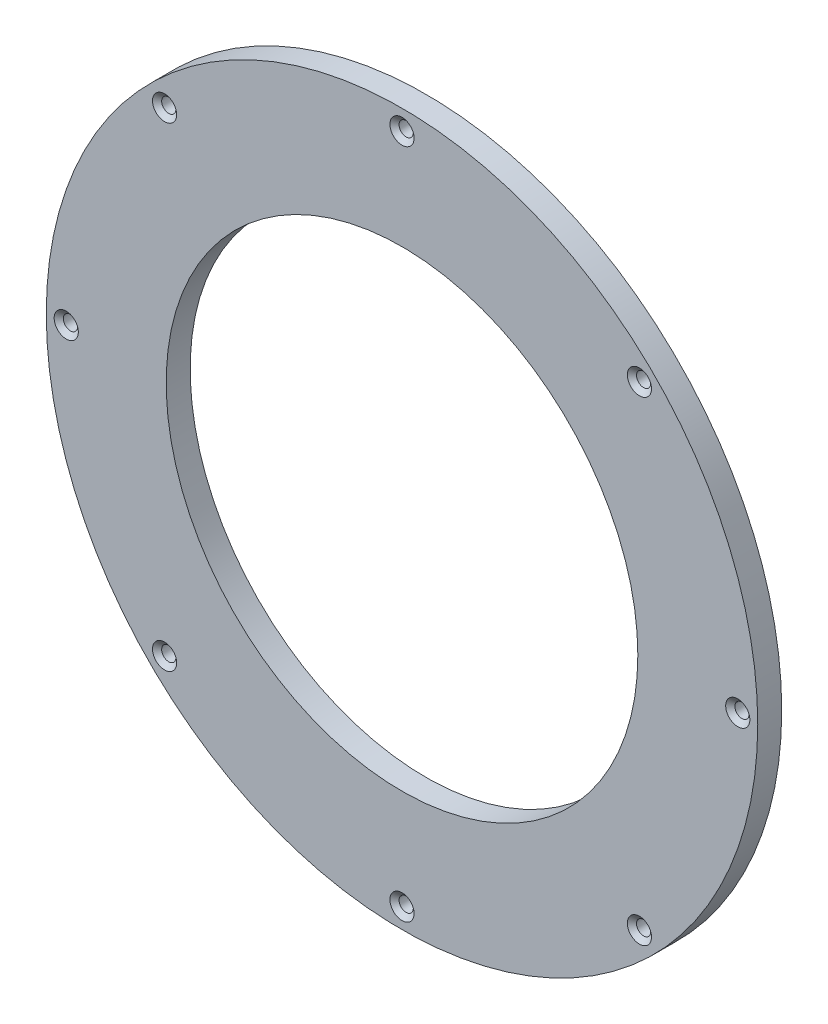
ISO-10303-21;
HEADER;
FILE_DESCRIPTION(('STEP AP214'),'2;1');
FILE_NAME('part.step','',(''),(''),'','','');
FILE_SCHEMA(('AUTOMOTIVE_DESIGN { 1 0 10303 214 1 1 1 1 }'));
ENDSEC;
DATA;
#1=APPLICATION_CONTEXT('core data for automotive mechanical design processes');
#2=APPLICATION_PROTOCOL_DEFINITION('international standard','automotive_design',2000,#1);
#3=PRODUCT_CONTEXT('',#1,'mechanical');
#4=PRODUCT('Part','Part','',(#3));
#5=PRODUCT_RELATED_PRODUCT_CATEGORY('part','',(#4));
#6=PRODUCT_DEFINITION_FORMATION('','',#4);
#7=PRODUCT_DEFINITION_CONTEXT('part definition',#1,'design');
#8=PRODUCT_DEFINITION('design','',#6,#7);
#9=PRODUCT_DEFINITION_SHAPE('','',#8);
#10=(LENGTH_UNIT() NAMED_UNIT(*) SI_UNIT(.MILLI.,.METRE.));
#11=(NAMED_UNIT(*) PLANE_ANGLE_UNIT() SI_UNIT($,.RADIAN.));
#12=(NAMED_UNIT(*) SI_UNIT($,.STERADIAN.) SOLID_ANGLE_UNIT());
#13=UNCERTAINTY_MEASURE_WITH_UNIT(LENGTH_MEASURE(1.E-05),#10,'distance_accuracy_value','');
#14=(GEOMETRIC_REPRESENTATION_CONTEXT(3) GLOBAL_UNCERTAINTY_ASSIGNED_CONTEXT((#13)) GLOBAL_UNIT_ASSIGNED_CONTEXT((#10,
#11,#12)) REPRESENTATION_CONTEXT('',''));
#15=CARTESIAN_POINT('',(0.,0.,0.));
#16=DIRECTION('',(0.,0.,1.));
#17=DIRECTION('',(1.,0.,0.));
#18=AXIS2_PLACEMENT_3D('',#15,#16,#17);
#19=CARTESIAN_POINT('',(0.,0.,3.));
#20=DIRECTION('',(0.,0.,-1.));
#21=DIRECTION('',(-1.,0.,0.));
#22=AXIS2_PLACEMENT_3D('',#19,#20,#21);
#23=CYLINDRICAL_SURFACE('',#22,44.5);
#24=CARTESIAN_POINT('',(0.,0.,3.));
#25=DIRECTION('',(0.,0.,1.));
#26=DIRECTION('',(1.,0.,0.));
#27=AXIS2_PLACEMENT_3D('',#24,#25,#26);
#28=CIRCLE('',#27,44.5);
#29=CARTESIAN_POINT('',(44.5,0.,3.));
#30=VERTEX_POINT('',#29);
#31=EDGE_CURVE('E10',#30,#30,#28,.T.);
#32=ORIENTED_EDGE('',*,*,#31,.F.);
#33=EDGE_LOOP('',(#32));
#34=FACE_BOUND('',#33,.T.);
#35=CARTESIAN_POINT('',(0.,0.,0.));
#36=DIRECTION('',(0.,0.,1.));
#37=DIRECTION('',(1.,0.,0.));
#38=AXIS2_PLACEMENT_3D('',#35,#36,#37);
#39=CIRCLE('',#38,44.5);
#40=CARTESIAN_POINT('',(44.5,0.,0.));
#41=VERTEX_POINT('',#40);
#42=EDGE_CURVE('E46',#41,#41,#39,.T.);
#43=ORIENTED_EDGE('',*,*,#42,.T.);
#44=EDGE_LOOP('',(#43));
#45=FACE_BOUND('',#44,.T.);
#46=ADVANCED_FACE('F43',(#34,#45),#23,.T.);
#47=CARTESIAN_POINT('',(0.,0.,3.));
#48=DIRECTION('',(0.,0.,1.));
#49=DIRECTION('',(1.,0.,0.));
#50=AXIS2_PLACEMENT_3D('',#47,#48,#49);
#51=PLANE('',#50);
#52=CARTESIAN_POINT('',(29.6984848098346,29.6984848098354,3.));
#53=DIRECTION('',(0.,0.,1.));
#54=DIRECTION('',(1.,0.,0.));
#55=AXIS2_PLACEMENT_3D('',#52,#53,#54);
#56=CIRCLE('',#55,1.5113);
#57=CARTESIAN_POINT('',(31.2097848098346,29.6984848098354,3.));
#58=VERTEX_POINT('',#57);
#59=EDGE_CURVE('E156',#58,#58,#56,.T.);
#60=ORIENTED_EDGE('',*,*,#59,.F.);
#61=EDGE_LOOP('',(#60));
#62=FACE_BOUND('',#61,.T.);
#63=CARTESIAN_POINT('',(42.,4.39926648694235E-13,3.));
#64=DIRECTION('',(0.,0.,1.));
#65=DIRECTION('',(1.,0.,0.));
#66=AXIS2_PLACEMENT_3D('',#63,#64,#65);
#67=CIRCLE('',#66,1.5113);
#68=CARTESIAN_POINT('',(43.5113,4.39926648694235E-13,3.));
#69=VERTEX_POINT('',#68);
#70=EDGE_CURVE('E144',#69,#69,#67,.T.);
#71=ORIENTED_EDGE('',*,*,#70,.F.);
#72=EDGE_LOOP('',(#71));
#73=FACE_BOUND('',#72,.T.);
#74=CARTESIAN_POINT('',(29.6984848098353,-29.6984848098347,3.));
#75=DIRECTION('',(0.,0.,1.));
#76=DIRECTION('',(1.,0.,0.));
#77=AXIS2_PLACEMENT_3D('',#74,#75,#76);
#78=CIRCLE('',#77,1.5113);
#79=CARTESIAN_POINT('',(31.2097848098353,-29.6984848098347,3.));
#80=VERTEX_POINT('',#79);
#81=EDGE_CURVE('E132',#80,#80,#78,.T.);
#82=ORIENTED_EDGE('',*,*,#81,.F.);
#83=EDGE_LOOP('',(#82));
#84=FACE_BOUND('',#83,.T.);
#85=CARTESIAN_POINT('',(0.,-42.,3.));
#86=DIRECTION('',(0.,0.,1.));
#87=DIRECTION('',(1.,0.,0.));
#88=AXIS2_PLACEMENT_3D('',#85,#86,#87);
#89=CIRCLE('',#88,1.5113);
#90=CARTESIAN_POINT('',(1.5113,-42.,3.));
#91=VERTEX_POINT('',#90);
#92=EDGE_CURVE('E120',#91,#91,#89,.T.);
#93=ORIENTED_EDGE('',*,*,#92,.F.);
#94=EDGE_LOOP('',(#93));
#95=FACE_BOUND('',#94,.T.);
#96=CARTESIAN_POINT('',(-29.6984848098348,-29.6984848098352,3.));
#97=DIRECTION('',(0.,0.,1.));
#98=DIRECTION('',(1.,0.,0.));
#99=AXIS2_PLACEMENT_3D('',#96,#97,#98);
#100=CIRCLE('',#99,1.5113);
#101=CARTESIAN_POINT('',(-28.1871848098348,-29.6984848098352,3.));
#102=VERTEX_POINT('',#101);
#103=EDGE_CURVE('E108',#102,#102,#100,.T.);
#104=ORIENTED_EDGE('',*,*,#103,.F.);
#105=EDGE_LOOP('',(#104));
#106=FACE_BOUND('',#105,.T.);
#107=CARTESIAN_POINT('',(-42.,-1.46642216231412E-13,3.));
#108=DIRECTION('',(0.,0.,1.));
#109=DIRECTION('',(1.,0.,0.));
#110=AXIS2_PLACEMENT_3D('',#107,#108,#109);
#111=CIRCLE('',#110,1.5113);
#112=CARTESIAN_POINT('',(-40.4887,-1.46642216231412E-13,3.));
#113=VERTEX_POINT('',#112);
#114=EDGE_CURVE('E96',#113,#113,#111,.T.);
#115=ORIENTED_EDGE('',*,*,#114,.F.);
#116=EDGE_LOOP('',(#115));
#117=FACE_BOUND('',#116,.T.);
#118=CARTESIAN_POINT('',(-29.6984848098351,29.6984848098349,3.));
#119=DIRECTION('',(0.,0.,1.));
#120=DIRECTION('',(1.,0.,0.));
#121=AXIS2_PLACEMENT_3D('',#118,#119,#120);
#122=CIRCLE('',#121,1.5113);
#123=CARTESIAN_POINT('',(-28.187184809835,29.6984848098349,3.));
#124=VERTEX_POINT('',#123);
#125=EDGE_CURVE('E84',#124,#124,#122,.T.);
#126=ORIENTED_EDGE('',*,*,#125,.F.);
#127=EDGE_LOOP('',(#126));
#128=FACE_BOUND('',#127,.T.);
#129=CARTESIAN_POINT('',(0.,42.,3.));
#130=DIRECTION('',(0.,0.,1.));
#131=DIRECTION('',(1.,0.,0.));
#132=AXIS2_PLACEMENT_3D('',#129,#130,#131);
#133=CIRCLE('',#132,1.5113);
#134=CARTESIAN_POINT('',(1.5113,42.,3.));
#135=VERTEX_POINT('',#134);
#136=EDGE_CURVE('E72',#135,#135,#133,.T.);
#137=ORIENTED_EDGE('',*,*,#136,.F.);
#138=EDGE_LOOP('',(#137));
#139=FACE_BOUND('',#138,.T.);
#140=CARTESIAN_POINT('',(0.,0.,3.));
#141=DIRECTION('',(0.,0.,1.));
#142=DIRECTION('',(1.,0.,0.));
#143=AXIS2_PLACEMENT_3D('',#140,#141,#142);
#144=CIRCLE('',#143,29.5);
#145=CARTESIAN_POINT('',(29.5,0.,3.));
#146=VERTEX_POINT('',#145);
#147=EDGE_CURVE('E60',#146,#146,#144,.T.);
#148=ORIENTED_EDGE('',*,*,#147,.F.);
#149=EDGE_LOOP('',(#148));
#150=FACE_BOUND('',#149,.T.);
#151=ORIENTED_EDGE('',*,*,#31,.T.);
#152=EDGE_LOOP('',(#151));
#153=FACE_BOUND('',#152,.T.);
#154=ADVANCED_FACE('F163',(#62,#73,#84,#95,#106,#117,#128,#139,#150,#153),#51,.T.);
#155=CARTESIAN_POINT('',(0.,0.,0.));
#156=DIRECTION('',(0.,0.,1.));
#157=DIRECTION('',(1.,0.,0.));
#158=AXIS2_PLACEMENT_3D('',#155,#156,#157);
#159=PLANE('',#158);
#160=CARTESIAN_POINT('',(29.6984848098346,29.6984848098354,0.));
#161=DIRECTION('',(0.,0.,1.));
#162=DIRECTION('',(1.,0.,0.));
#163=AXIS2_PLACEMENT_3D('',#160,#161,#162);
#164=CIRCLE('',#163,0.889000000000001);
#165=CARTESIAN_POINT('',(30.5874848098346,29.6984848098354,0.));
#166=VERTEX_POINT('',#165);
#167=EDGE_CURVE('E148',#166,#166,#164,.T.);
#168=ORIENTED_EDGE('',*,*,#167,.T.);
#169=EDGE_LOOP('',(#168));
#170=FACE_BOUND('',#169,.T.);
#171=CARTESIAN_POINT('',(42.,4.39926648694235E-13,0.));
#172=DIRECTION('',(0.,0.,1.));
#173=DIRECTION('',(1.,0.,0.));
#174=AXIS2_PLACEMENT_3D('',#171,#172,#173);
#175=CIRCLE('',#174,0.889000000000001);
#176=CARTESIAN_POINT('',(42.889,4.39926648694235E-13,0.));
#177=VERTEX_POINT('',#176);
#178=EDGE_CURVE('E136',#177,#177,#175,.T.);
#179=ORIENTED_EDGE('',*,*,#178,.T.);
#180=EDGE_LOOP('',(#179));
#181=FACE_BOUND('',#180,.T.);
#182=CARTESIAN_POINT('',(29.6984848098353,-29.6984848098347,0.));
#183=DIRECTION('',(0.,0.,1.));
#184=DIRECTION('',(1.,0.,0.));
#185=AXIS2_PLACEMENT_3D('',#182,#183,#184);
#186=CIRCLE('',#185,0.889000000000001);
#187=CARTESIAN_POINT('',(30.5874848098353,-29.6984848098347,0.));
#188=VERTEX_POINT('',#187);
#189=EDGE_CURVE('E124',#188,#188,#186,.T.);
#190=ORIENTED_EDGE('',*,*,#189,.T.);
#191=EDGE_LOOP('',(#190));
#192=FACE_BOUND('',#191,.T.);
#193=CARTESIAN_POINT('',(0.,-42.,0.));
#194=DIRECTION('',(0.,0.,1.));
#195=DIRECTION('',(1.,0.,0.));
#196=AXIS2_PLACEMENT_3D('',#193,#194,#195);
#197=CIRCLE('',#196,0.888999999999999);
#198=CARTESIAN_POINT('',(0.888999999999999,-42.,0.));
#199=VERTEX_POINT('',#198);
#200=EDGE_CURVE('E112',#199,#199,#197,.T.);
#201=ORIENTED_EDGE('',*,*,#200,.T.);
#202=EDGE_LOOP('',(#201));
#203=FACE_BOUND('',#202,.T.);
#204=CARTESIAN_POINT('',(-29.6984848098348,-29.6984848098352,0.));
#205=DIRECTION('',(0.,0.,1.));
#206=DIRECTION('',(1.,0.,0.));
#207=AXIS2_PLACEMENT_3D('',#204,#205,#206);
#208=CIRCLE('',#207,0.889000000000001);
#209=CARTESIAN_POINT('',(-28.8094848098348,-29.6984848098352,0.));
#210=VERTEX_POINT('',#209);
#211=EDGE_CURVE('E100',#210,#210,#208,.T.);
#212=ORIENTED_EDGE('',*,*,#211,.T.);
#213=EDGE_LOOP('',(#212));
#214=FACE_BOUND('',#213,.T.);
#215=CARTESIAN_POINT('',(-42.,-1.46642216231412E-13,0.));
#216=DIRECTION('',(0.,0.,1.));
#217=DIRECTION('',(1.,0.,0.));
#218=AXIS2_PLACEMENT_3D('',#215,#216,#217);
#219=CIRCLE('',#218,0.889000000000001);
#220=CARTESIAN_POINT('',(-41.111,-1.46642216231412E-13,0.));
#221=VERTEX_POINT('',#220);
#222=EDGE_CURVE('E88',#221,#221,#219,.T.);
#223=ORIENTED_EDGE('',*,*,#222,.T.);
#224=EDGE_LOOP('',(#223));
#225=FACE_BOUND('',#224,.T.);
#226=CARTESIAN_POINT('',(-29.6984848098351,29.6984848098349,0.));
#227=DIRECTION('',(0.,0.,1.));
#228=DIRECTION('',(1.,0.,0.));
#229=AXIS2_PLACEMENT_3D('',#226,#227,#228);
#230=CIRCLE('',#229,0.889000000000001);
#231=CARTESIAN_POINT('',(-28.809484809835,29.6984848098349,0.));
#232=VERTEX_POINT('',#231);
#233=EDGE_CURVE('E76',#232,#232,#230,.T.);
#234=ORIENTED_EDGE('',*,*,#233,.T.);
#235=EDGE_LOOP('',(#234));
#236=FACE_BOUND('',#235,.T.);
#237=CARTESIAN_POINT('',(0.,42.,0.));
#238=DIRECTION('',(0.,0.,1.));
#239=DIRECTION('',(1.,0.,0.));
#240=AXIS2_PLACEMENT_3D('',#237,#238,#239);
#241=CIRCLE('',#240,0.888999999999999);
#242=CARTESIAN_POINT('',(0.888999999999999,42.,0.));
#243=VERTEX_POINT('',#242);
#244=EDGE_CURVE('E64',#243,#243,#241,.T.);
#245=ORIENTED_EDGE('',*,*,#244,.T.);
#246=EDGE_LOOP('',(#245));
#247=FACE_BOUND('',#246,.T.);
#248=CARTESIAN_POINT('',(0.,0.,0.));
#249=DIRECTION('',(0.,0.,1.));
#250=DIRECTION('',(1.,0.,0.));
#251=AXIS2_PLACEMENT_3D('',#248,#249,#250);
#252=CIRCLE('',#251,29.5);
#253=CARTESIAN_POINT('',(29.5,0.,0.));
#254=VERTEX_POINT('',#253);
#255=EDGE_CURVE('E55',#254,#254,#252,.F.);
#256=ORIENTED_EDGE('',*,*,#255,.F.);
#257=EDGE_LOOP('',(#256));
#258=FACE_BOUND('',#257,.T.);
#259=ORIENTED_EDGE('',*,*,#42,.F.);
#260=EDGE_LOOP('',(#259));
#261=FACE_BOUND('',#260,.T.);
#262=ADVANCED_FACE('F166',(#170,#181,#192,#203,#214,#225,#236,#247,#258,#261),#159,.F.);
#263=CARTESIAN_POINT('',(0.,0.,-83.4386001800126));
#264=DIRECTION('',(0.,0.,1.));
#265=DIRECTION('',(1.,0.,0.));
#266=AXIS2_PLACEMENT_3D('',#263,#264,#265);
#267=CYLINDRICAL_SURFACE('',#266,29.5);
#268=ORIENTED_EDGE('',*,*,#255,.T.);
#269=EDGE_LOOP('',(#268));
#270=FACE_BOUND('',#269,.T.);
#271=ORIENTED_EDGE('',*,*,#147,.T.);
#272=EDGE_LOOP('',(#271));
#273=FACE_BOUND('',#272,.T.);
#274=ADVANCED_FACE('F184',(#270,#273),#267,.F.);
#275=CARTESIAN_POINT('',(0.,42.,3.));
#276=DIRECTION('',(0.,0.,1.));
#277=DIRECTION('',(1.,0.,0.));
#278=AXIS2_PLACEMENT_3D('',#275,#276,#277);
#279=CYLINDRICAL_SURFACE('',#278,0.888999999999999);
#280=ORIENTED_EDGE('',*,*,#244,.F.);
#281=EDGE_LOOP('',(#280));
#282=FACE_BOUND('',#281,.T.);
#283=CARTESIAN_POINT('',(0.,42.,2.47782829951838));
#284=DIRECTION('',(0.,0.,1.));
#285=DIRECTION('',(1.,0.,0.));
#286=AXIS2_PLACEMENT_3D('',#283,#284,#285);
#287=CIRCLE('',#286,0.889);
#288=CARTESIAN_POINT('',(0.889,42.,2.47782829951838));
#289=VERTEX_POINT('',#288);
#290=EDGE_CURVE('E68',#289,#289,#287,.T.);
#291=ORIENTED_EDGE('',*,*,#290,.T.);
#292=EDGE_LOOP('',(#291));
#293=FACE_BOUND('',#292,.T.);
#294=ADVANCED_FACE('F186',(#282,#293),#279,.F.);
#295=CARTESIAN_POINT('',(0.,42.,3.));
#296=DIRECTION('',(0.,0.,1.));
#297=DIRECTION('',(1.,0.,0.));
#298=AXIS2_PLACEMENT_3D('',#295,#296,#297);
#299=CONICAL_SURFACE('',#298,1.5113,0.872664625997163);
#300=ORIENTED_EDGE('',*,*,#290,.F.);
#301=EDGE_LOOP('',(#300));
#302=FACE_BOUND('',#301,.T.);
#303=ORIENTED_EDGE('',*,*,#136,.T.);
#304=EDGE_LOOP('',(#303));
#305=FACE_BOUND('',#304,.T.);
#306=ADVANCED_FACE('F193',(#302,#305),#299,.F.);
#307=CARTESIAN_POINT('',(-29.6984848098351,29.6984848098349,3.));
#308=DIRECTION('',(0.,0.,1.));
#309=DIRECTION('',(1.,0.,0.));
#310=AXIS2_PLACEMENT_3D('',#307,#308,#309);
#311=CYLINDRICAL_SURFACE('',#310,0.889000000000001);
#312=ORIENTED_EDGE('',*,*,#233,.F.);
#313=EDGE_LOOP('',(#312));
#314=FACE_BOUND('',#313,.T.);
#315=CARTESIAN_POINT('',(-29.6984848098351,29.6984848098349,2.47782829951838));
#316=DIRECTION('',(0.,0.,1.));
#317=DIRECTION('',(1.,0.,0.));
#318=AXIS2_PLACEMENT_3D('',#315,#316,#317);
#319=CIRCLE('',#318,0.889000000000001);
#320=CARTESIAN_POINT('',(-28.809484809835,29.6984848098349,2.47782829951838));
#321=VERTEX_POINT('',#320);
#322=EDGE_CURVE('E80',#321,#321,#319,.T.);
#323=ORIENTED_EDGE('',*,*,#322,.T.);
#324=EDGE_LOOP('',(#323));
#325=FACE_BOUND('',#324,.T.);
#326=ADVANCED_FACE('F237',(#314,#325),#311,.F.);
#327=CARTESIAN_POINT('',(-29.6984848098351,29.6984848098349,3.));
#328=DIRECTION('',(0.,0.,1.));
#329=DIRECTION('',(1.,0.,0.));
#330=AXIS2_PLACEMENT_3D('',#327,#328,#329);
#331=CONICAL_SURFACE('',#330,1.5113,0.872664625997162);
#332=ORIENTED_EDGE('',*,*,#322,.F.);
#333=EDGE_LOOP('',(#332));
#334=FACE_BOUND('',#333,.T.);
#335=ORIENTED_EDGE('',*,*,#125,.T.);
#336=EDGE_LOOP('',(#335));
#337=FACE_BOUND('',#336,.T.);
#338=ADVANCED_FACE('F246',(#334,#337),#331,.F.);
#339=CARTESIAN_POINT('',(-42.,-1.46642216231412E-13,3.));
#340=DIRECTION('',(0.,0.,1.));
#341=DIRECTION('',(1.,0.,0.));
#342=AXIS2_PLACEMENT_3D('',#339,#340,#341);
#343=CYLINDRICAL_SURFACE('',#342,0.889000000000001);
#344=ORIENTED_EDGE('',*,*,#222,.F.);
#345=EDGE_LOOP('',(#344));
#346=FACE_BOUND('',#345,.T.);
#347=CARTESIAN_POINT('',(-42.,-1.46642216231412E-13,2.47782829951838));
#348=DIRECTION('',(0.,0.,1.));
#349=DIRECTION('',(1.,0.,0.));
#350=AXIS2_PLACEMENT_3D('',#347,#348,#349);
#351=CIRCLE('',#350,0.889000000000001);
#352=CARTESIAN_POINT('',(-41.111,-1.46642216231412E-13,2.47782829951838));
#353=VERTEX_POINT('',#352);
#354=EDGE_CURVE('E92',#353,#353,#351,.T.);
#355=ORIENTED_EDGE('',*,*,#354,.T.);
#356=EDGE_LOOP('',(#355));
#357=FACE_BOUND('',#356,.T.);
#358=ADVANCED_FACE('F256',(#346,#357),#343,.F.);
#359=CARTESIAN_POINT('',(-42.,-1.46642216231412E-13,3.));
#360=DIRECTION('',(0.,0.,1.));
#361=DIRECTION('',(1.,0.,0.));
#362=AXIS2_PLACEMENT_3D('',#359,#360,#361);
#363=CONICAL_SURFACE('',#362,1.5113,0.872664625997162);
#364=ORIENTED_EDGE('',*,*,#354,.F.);
#365=EDGE_LOOP('',(#364));
#366=FACE_BOUND('',#365,.T.);
#367=ORIENTED_EDGE('',*,*,#114,.T.);
#368=EDGE_LOOP('',(#367));
#369=FACE_BOUND('',#368,.T.);
#370=ADVANCED_FACE('F266',(#366,#369),#363,.F.);
#371=CARTESIAN_POINT('',(-29.6984848098348,-29.6984848098352,3.));
#372=DIRECTION('',(0.,0.,1.));
#373=DIRECTION('',(1.,0.,0.));
#374=AXIS2_PLACEMENT_3D('',#371,#372,#373);
#375=CYLINDRICAL_SURFACE('',#374,0.889000000000001);
#376=ORIENTED_EDGE('',*,*,#211,.F.);
#377=EDGE_LOOP('',(#376));
#378=FACE_BOUND('',#377,.T.);
#379=CARTESIAN_POINT('',(-29.6984848098348,-29.6984848098352,2.47782829951838));
#380=DIRECTION('',(0.,0.,1.));
#381=DIRECTION('',(1.,0.,0.));
#382=AXIS2_PLACEMENT_3D('',#379,#380,#381);
#383=CIRCLE('',#382,0.889000000000001);
#384=CARTESIAN_POINT('',(-28.8094848098348,-29.6984848098352,2.47782829951838));
#385=VERTEX_POINT('',#384);
#386=EDGE_CURVE('E104',#385,#385,#383,.T.);
#387=ORIENTED_EDGE('',*,*,#386,.T.);
#388=EDGE_LOOP('',(#387));
#389=FACE_BOUND('',#388,.T.);
#390=ADVANCED_FACE('F276',(#378,#389),#375,.F.);
#391=CARTESIAN_POINT('',(-29.6984848098348,-29.6984848098352,3.));
#392=DIRECTION('',(0.,0.,1.));
#393=DIRECTION('',(1.,0.,0.));
#394=AXIS2_PLACEMENT_3D('',#391,#392,#393);
#395=CONICAL_SURFACE('',#394,1.5113,0.872664625997162);
#396=ORIENTED_EDGE('',*,*,#386,.F.);
#397=EDGE_LOOP('',(#396));
#398=FACE_BOUND('',#397,.T.);
#399=ORIENTED_EDGE('',*,*,#103,.T.);
#400=EDGE_LOOP('',(#399));
#401=FACE_BOUND('',#400,.T.);
#402=ADVANCED_FACE('F286',(#398,#401),#395,.F.);
#403=CARTESIAN_POINT('',(0.,-42.,3.));
#404=DIRECTION('',(0.,0.,1.));
#405=DIRECTION('',(1.,0.,0.));
#406=AXIS2_PLACEMENT_3D('',#403,#404,#405);
#407=CYLINDRICAL_SURFACE('',#406,0.888999999999999);
#408=ORIENTED_EDGE('',*,*,#200,.F.);
#409=EDGE_LOOP('',(#408));
#410=FACE_BOUND('',#409,.T.);
#411=CARTESIAN_POINT('',(0.,-42.,2.47782829951838));
#412=DIRECTION('',(0.,0.,1.));
#413=DIRECTION('',(1.,0.,0.));
#414=AXIS2_PLACEMENT_3D('',#411,#412,#413);
#415=CIRCLE('',#414,0.889);
#416=CARTESIAN_POINT('',(0.889,-42.,2.47782829951838));
#417=VERTEX_POINT('',#416);
#418=EDGE_CURVE('E116',#417,#417,#415,.T.);
#419=ORIENTED_EDGE('',*,*,#418,.T.);
#420=EDGE_LOOP('',(#419));
#421=FACE_BOUND('',#420,.T.);
#422=ADVANCED_FACE('F296',(#410,#421),#407,.F.);
#423=CARTESIAN_POINT('',(0.,-42.,3.));
#424=DIRECTION('',(0.,0.,1.));
#425=DIRECTION('',(1.,0.,0.));
#426=AXIS2_PLACEMENT_3D('',#423,#424,#425);
#427=CONICAL_SURFACE('',#426,1.5113,0.872664625997163);
#428=ORIENTED_EDGE('',*,*,#418,.F.);
#429=EDGE_LOOP('',(#428));
#430=FACE_BOUND('',#429,.T.);
#431=ORIENTED_EDGE('',*,*,#92,.T.);
#432=EDGE_LOOP('',(#431));
#433=FACE_BOUND('',#432,.T.);
#434=ADVANCED_FACE('F306',(#430,#433),#427,.F.);
#435=CARTESIAN_POINT('',(29.6984848098353,-29.6984848098347,3.));
#436=DIRECTION('',(0.,0.,1.));
#437=DIRECTION('',(1.,0.,0.));
#438=AXIS2_PLACEMENT_3D('',#435,#436,#437);
#439=CYLINDRICAL_SURFACE('',#438,0.889000000000001);
#440=ORIENTED_EDGE('',*,*,#189,.F.);
#441=EDGE_LOOP('',(#440));
#442=FACE_BOUND('',#441,.T.);
#443=CARTESIAN_POINT('',(29.6984848098353,-29.6984848098347,2.47782829951838));
#444=DIRECTION('',(0.,0.,1.));
#445=DIRECTION('',(1.,0.,0.));
#446=AXIS2_PLACEMENT_3D('',#443,#444,#445);
#447=CIRCLE('',#446,0.889000000000001);
#448=CARTESIAN_POINT('',(30.5874848098353,-29.6984848098347,2.47782829951838));
#449=VERTEX_POINT('',#448);
#450=EDGE_CURVE('E128',#449,#449,#447,.T.);
#451=ORIENTED_EDGE('',*,*,#450,.T.);
#452=EDGE_LOOP('',(#451));
#453=FACE_BOUND('',#452,.T.);
#454=ADVANCED_FACE('F316',(#442,#453),#439,.F.);
#455=CARTESIAN_POINT('',(29.6984848098353,-29.6984848098347,3.));
#456=DIRECTION('',(0.,0.,1.));
#457=DIRECTION('',(1.,0.,0.));
#458=AXIS2_PLACEMENT_3D('',#455,#456,#457);
#459=CONICAL_SURFACE('',#458,1.5113,0.872664625997162);
#460=ORIENTED_EDGE('',*,*,#450,.F.);
#461=EDGE_LOOP('',(#460));
#462=FACE_BOUND('',#461,.T.);
#463=ORIENTED_EDGE('',*,*,#81,.T.);
#464=EDGE_LOOP('',(#463));
#465=FACE_BOUND('',#464,.T.);
#466=ADVANCED_FACE('F326',(#462,#465),#459,.F.);
#467=CARTESIAN_POINT('',(42.,4.39926648694235E-13,3.));
#468=DIRECTION('',(0.,0.,1.));
#469=DIRECTION('',(1.,0.,0.));
#470=AXIS2_PLACEMENT_3D('',#467,#468,#469);
#471=CYLINDRICAL_SURFACE('',#470,0.889000000000001);
#472=ORIENTED_EDGE('',*,*,#178,.F.);
#473=EDGE_LOOP('',(#472));
#474=FACE_BOUND('',#473,.T.);
#475=CARTESIAN_POINT('',(42.,4.39926648694235E-13,2.47782829951838));
#476=DIRECTION('',(0.,0.,1.));
#477=DIRECTION('',(1.,0.,0.));
#478=AXIS2_PLACEMENT_3D('',#475,#476,#477);
#479=CIRCLE('',#478,0.889000000000001);
#480=CARTESIAN_POINT('',(42.889,4.39926648694235E-13,2.47782829951838));
#481=VERTEX_POINT('',#480);
#482=EDGE_CURVE('E140',#481,#481,#479,.T.);
#483=ORIENTED_EDGE('',*,*,#482,.T.);
#484=EDGE_LOOP('',(#483));
#485=FACE_BOUND('',#484,.T.);
#486=ADVANCED_FACE('F336',(#474,#485),#471,.F.);
#487=CARTESIAN_POINT('',(42.,4.39926648694235E-13,3.));
#488=DIRECTION('',(0.,0.,1.));
#489=DIRECTION('',(1.,0.,0.));
#490=AXIS2_PLACEMENT_3D('',#487,#488,#489);
#491=CONICAL_SURFACE('',#490,1.5113,0.872664625997162);
#492=ORIENTED_EDGE('',*,*,#482,.F.);
#493=EDGE_LOOP('',(#492));
#494=FACE_BOUND('',#493,.T.);
#495=ORIENTED_EDGE('',*,*,#70,.T.);
#496=EDGE_LOOP('',(#495));
#497=FACE_BOUND('',#496,.T.);
#498=ADVANCED_FACE('F346',(#494,#497),#491,.F.);
#499=CARTESIAN_POINT('',(29.6984848098346,29.6984848098354,3.));
#500=DIRECTION('',(0.,0.,1.));
#501=DIRECTION('',(1.,0.,0.));
#502=AXIS2_PLACEMENT_3D('',#499,#500,#501);
#503=CYLINDRICAL_SURFACE('',#502,0.889000000000001);
#504=ORIENTED_EDGE('',*,*,#167,.F.);
#505=EDGE_LOOP('',(#504));
#506=FACE_BOUND('',#505,.T.);
#507=CARTESIAN_POINT('',(29.6984848098346,29.6984848098354,2.47782829951838));
#508=DIRECTION('',(0.,0.,1.));
#509=DIRECTION('',(1.,0.,0.));
#510=AXIS2_PLACEMENT_3D('',#507,#508,#509);
#511=CIRCLE('',#510,0.889000000000001);
#512=CARTESIAN_POINT('',(30.5874848098346,29.6984848098354,2.47782829951838));
#513=VERTEX_POINT('',#512);
#514=EDGE_CURVE('E152',#513,#513,#511,.T.);
#515=ORIENTED_EDGE('',*,*,#514,.T.);
#516=EDGE_LOOP('',(#515));
#517=FACE_BOUND('',#516,.T.);
#518=ADVANCED_FACE('F356',(#506,#517),#503,.F.);
#519=CARTESIAN_POINT('',(29.6984848098346,29.6984848098354,3.));
#520=DIRECTION('',(0.,0.,1.));
#521=DIRECTION('',(1.,0.,0.));
#522=AXIS2_PLACEMENT_3D('',#519,#520,#521);
#523=CONICAL_SURFACE('',#522,1.5113,0.872664625997162);
#524=ORIENTED_EDGE('',*,*,#514,.F.);
#525=EDGE_LOOP('',(#524));
#526=FACE_BOUND('',#525,.T.);
#527=ORIENTED_EDGE('',*,*,#59,.T.);
#528=EDGE_LOOP('',(#527));
#529=FACE_BOUND('',#528,.T.);
#530=ADVANCED_FACE('F161',(#526,#529),#523,.F.);
#531=CLOSED_SHELL('',(#46,#154,#262,#274,#294,#306,#326,#338,#358,#370,#390,#402,#422,#434,#454,
#466,#486,#498,#518,#530));
#532=MANIFOLD_SOLID_BREP('B2',#531);
#533=ADVANCED_BREP_SHAPE_REPRESENTATION('',(#18,#532),#14);
#534=SHAPE_DEFINITION_REPRESENTATION(#9,#533);
ENDSEC;
END-ISO-10303-21;
